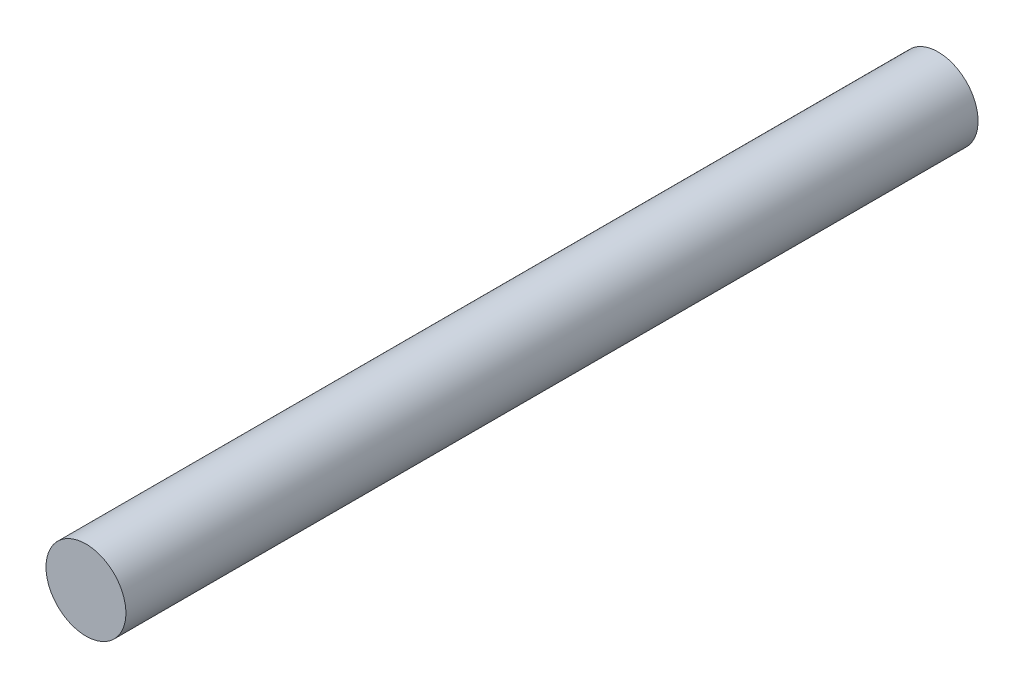
ISO-10303-21;
HEADER;
FILE_DESCRIPTION(('STEP AP214'),'2;1');
FILE_NAME('part.step','',(''),(''),'','','');
FILE_SCHEMA(('AUTOMOTIVE_DESIGN { 1 0 10303 214 1 1 1 1 }'));
ENDSEC;
DATA;
#1=APPLICATION_CONTEXT('core data for automotive mechanical design processes');
#2=APPLICATION_PROTOCOL_DEFINITION('international standard','automotive_design',2000,#1);
#3=PRODUCT_CONTEXT('',#1,'mechanical');
#4=PRODUCT('Part','Part','',(#3));
#5=PRODUCT_RELATED_PRODUCT_CATEGORY('part','',(#4));
#6=PRODUCT_DEFINITION_FORMATION('','',#4);
#7=PRODUCT_DEFINITION_CONTEXT('part definition',#1,'design');
#8=PRODUCT_DEFINITION('design','',#6,#7);
#9=PRODUCT_DEFINITION_SHAPE('','',#8);
#10=(LENGTH_UNIT() NAMED_UNIT(*) SI_UNIT(.MILLI.,.METRE.));
#11=(NAMED_UNIT(*) PLANE_ANGLE_UNIT() SI_UNIT($,.RADIAN.));
#12=(NAMED_UNIT(*) SI_UNIT($,.STERADIAN.) SOLID_ANGLE_UNIT());
#13=UNCERTAINTY_MEASURE_WITH_UNIT(LENGTH_MEASURE(1.E-05),#10,'distance_accuracy_value','');
#14=(GEOMETRIC_REPRESENTATION_CONTEXT(3) GLOBAL_UNCERTAINTY_ASSIGNED_CONTEXT((#13)) GLOBAL_UNIT_ASSIGNED_CONTEXT((#10,
#11,#12)) REPRESENTATION_CONTEXT('',''));
#15=CARTESIAN_POINT('',(0.,0.,0.));
#16=DIRECTION('',(0.,0.,1.));
#17=DIRECTION('',(1.,0.,0.));
#18=AXIS2_PLACEMENT_3D('',#15,#16,#17);
#19=CARTESIAN_POINT('',(0.,0.,304.8));
#20=DIRECTION('',(0.,0.,-1.));
#21=DIRECTION('',(-1.,0.,0.));
#22=AXIS2_PLACEMENT_3D('',#19,#20,#21);
#23=CYLINDRICAL_SURFACE('',#22,14.2875);
#24=CARTESIAN_POINT('',(0.,0.,304.8));
#25=DIRECTION('',(0.,0.,1.));
#26=DIRECTION('',(1.,0.,0.));
#27=AXIS2_PLACEMENT_3D('',#24,#25,#26);
#28=CIRCLE('',#27,14.2875);
#29=CARTESIAN_POINT('',(-14.2875,0.,304.8));
#30=VERTEX_POINT('',#29);
#31=EDGE_CURVE('E10',#30,#30,#28,.T.);
#32=CARTESIAN_POINT('',(0.,0.,0.));
#33=DIRECTION('',(0.,0.,1.));
#34=DIRECTION('',(1.,0.,0.));
#35=AXIS2_PLACEMENT_3D('',#32,#33,#34);
#36=CIRCLE('',#35,14.2875);
#37=CARTESIAN_POINT('',(-14.2875,0.,0.));
#38=VERTEX_POINT('',#37);
#39=EDGE_CURVE('E45',#38,#38,#36,.T.);
#40=CARTESIAN_POINT('',(-14.2875,0.,304.8));
#41=CARTESIAN_POINT('',(-14.2875,0.,301.625));
#42=CARTESIAN_POINT('',(-14.2875,0.,298.45));
#43=CARTESIAN_POINT('',(-14.2875,0.,292.1));
#44=CARTESIAN_POINT('',(-14.2875,0.,288.925));
#45=CARTESIAN_POINT('',(-14.2875,0.,282.575));
#46=CARTESIAN_POINT('',(-14.2875,0.,279.4));
#47=CARTESIAN_POINT('',(-14.2875,0.,273.05));
#48=CARTESIAN_POINT('',(-14.2875,0.,269.875));
#49=CARTESIAN_POINT('',(-14.2875,0.,263.525));
#50=CARTESIAN_POINT('',(-14.2875,0.,260.35));
#51=CARTESIAN_POINT('',(-14.2875,0.,254.));
#52=CARTESIAN_POINT('',(-14.2875,0.,250.825));
#53=CARTESIAN_POINT('',(-14.2875,0.,244.475));
#54=CARTESIAN_POINT('',(-14.2875,0.,241.3));
#55=CARTESIAN_POINT('',(-14.2875,0.,234.95));
#56=CARTESIAN_POINT('',(-14.2875,0.,231.775));
#57=CARTESIAN_POINT('',(-14.2875,0.,225.425));
#58=CARTESIAN_POINT('',(-14.2875,0.,222.25));
#59=CARTESIAN_POINT('',(-14.2875,0.,215.9));
#60=CARTESIAN_POINT('',(-14.2875,0.,212.725));
#61=CARTESIAN_POINT('',(-14.2875,0.,206.375));
#62=CARTESIAN_POINT('',(-14.2875,0.,203.2));
#63=CARTESIAN_POINT('',(-14.2875,0.,196.85));
#64=CARTESIAN_POINT('',(-14.2875,0.,193.675));
#65=CARTESIAN_POINT('',(-14.2875,0.,187.325));
#66=CARTESIAN_POINT('',(-14.2875,0.,184.15));
#67=CARTESIAN_POINT('',(-14.2875,0.,177.8));
#68=CARTESIAN_POINT('',(-14.2875,0.,174.625));
#69=CARTESIAN_POINT('',(-14.2875,0.,168.275));
#70=CARTESIAN_POINT('',(-14.2875,0.,165.1));
#71=CARTESIAN_POINT('',(-14.2875,0.,158.75));
#72=CARTESIAN_POINT('',(-14.2875,0.,155.575));
#73=CARTESIAN_POINT('',(-14.2875,0.,149.225));
#74=CARTESIAN_POINT('',(-14.2875,0.,146.05));
#75=CARTESIAN_POINT('',(-14.2875,0.,139.7));
#76=CARTESIAN_POINT('',(-14.2875,0.,136.525));
#77=CARTESIAN_POINT('',(-14.2875,0.,130.175));
#78=CARTESIAN_POINT('',(-14.2875,0.,127.));
#79=CARTESIAN_POINT('',(-14.2875,0.,120.65));
#80=CARTESIAN_POINT('',(-14.2875,0.,117.475));
#81=CARTESIAN_POINT('',(-14.2875,0.,111.125));
#82=CARTESIAN_POINT('',(-14.2875,0.,107.95));
#83=CARTESIAN_POINT('',(-14.2875,0.,101.6));
#84=CARTESIAN_POINT('',(-14.2875,0.,98.425));
#85=CARTESIAN_POINT('',(-14.2875,0.,92.075));
#86=CARTESIAN_POINT('',(-14.2875,0.,88.9));
#87=CARTESIAN_POINT('',(-14.2875,0.,82.55));
#88=CARTESIAN_POINT('',(-14.2875,0.,79.375));
#89=CARTESIAN_POINT('',(-14.2875,0.,73.025));
#90=CARTESIAN_POINT('',(-14.2875,0.,69.85));
#91=CARTESIAN_POINT('',(-14.2875,0.,63.5));
#92=CARTESIAN_POINT('',(-14.2875,0.,60.325));
#93=CARTESIAN_POINT('',(-14.2875,0.,53.975));
#94=CARTESIAN_POINT('',(-14.2875,0.,50.8));
#95=CARTESIAN_POINT('',(-14.2875,0.,44.45));
#96=CARTESIAN_POINT('',(-14.2875,0.,41.275));
#97=CARTESIAN_POINT('',(-14.2875,0.,34.925));
#98=CARTESIAN_POINT('',(-14.2875,0.,31.75));
#99=CARTESIAN_POINT('',(-14.2875,0.,25.4));
#100=CARTESIAN_POINT('',(-14.2875,0.,22.225));
#101=CARTESIAN_POINT('',(-14.2875,0.,15.875));
#102=CARTESIAN_POINT('',(-14.2875,0.,12.7));
#103=CARTESIAN_POINT('',(-14.2875,0.,6.35));
#104=CARTESIAN_POINT('',(-14.2875,0.,3.175));
#105=CARTESIAN_POINT('',(-14.2875,0.,0.));
#106=B_SPLINE_CURVE_WITH_KNOTS('',3,(#40,#41,#42,#43,#44,#45,#46,#47,#48,#49,#50,#51,#52,#53,
#54,#55,#56,#57,#58,#59,#60,#61,#62,#63,#64,#65,#66,#67,#68,#69,#70,#71,#72,#73,#74,#75,#76,#77,
#78,#79,#80,#81,#82,#83,#84,#85,#86,#87,#88,#89,#90,#91,#92,#93,#94,#95,#96,#97,#98,#99,#100,
#101,#102,#103,#104,#105),.UNSPECIFIED.,.F.,.F.,(4,2,2,2,2,2,2,2,2,2,2,2,2,2,2,2,2,2,2,2,2,2,2,
2,2,2,2,2,2,2,2,2,4),(0.,9.52500000000001,19.05,28.575,38.1,47.625,57.15,66.675,76.2,
85.7250000000001,95.2500000000001,104.775,114.3,123.825,133.35,142.875,152.4,161.925,171.45,
180.975,190.5,200.025,209.55,219.075,228.6,238.125,247.65,257.175,266.7,276.225,285.75,295.275,
304.8),.UNSPECIFIED.);
#107=EDGE_CURVE('BSEAM39',#30,#38,#106,.T.);
#108=ORIENTED_EDGE('',*,*,#31,.F.);
#109=ORIENTED_EDGE('',*,*,#39,.T.);
#110=ORIENTED_EDGE('',*,*,#107,.T.);
#111=ORIENTED_EDGE('',*,*,#107,.F.);
#112=EDGE_LOOP('',(#108,#110,#109,#111));
#113=FACE_BOUND('',#112,.T.);
#114=ADVANCED_FACE('F39',(#113),#23,.T.);
#115=CARTESIAN_POINT('',(0.,0.,304.8));
#116=DIRECTION('',(0.,0.,1.));
#117=DIRECTION('',(1.,0.,0.));
#118=AXIS2_PLACEMENT_3D('',#115,#116,#117);
#119=PLANE('',#118);
#120=ORIENTED_EDGE('',*,*,#31,.T.);
#121=EDGE_LOOP('',(#120));
#122=FACE_BOUND('',#121,.T.);
#123=ADVANCED_FACE('F53',(#122),#119,.T.);
#124=CARTESIAN_POINT('',(0.,0.,0.));
#125=DIRECTION('',(0.,0.,1.));
#126=DIRECTION('',(1.,0.,0.));
#127=AXIS2_PLACEMENT_3D('',#124,#125,#126);
#128=PLANE('',#127);
#129=ORIENTED_EDGE('',*,*,#39,.F.);
#130=EDGE_LOOP('',(#129));
#131=FACE_BOUND('',#130,.T.);
#132=ADVANCED_FACE('F55',(#131),#128,.F.);
#133=CLOSED_SHELL('',(#114,#123,#132));
#134=MANIFOLD_SOLID_BREP('B2',#133);
#135=ADVANCED_BREP_SHAPE_REPRESENTATION('',(#18,#134),#14);
#136=SHAPE_DEFINITION_REPRESENTATION(#9,#135);
ENDSEC;
END-ISO-10303-21;
